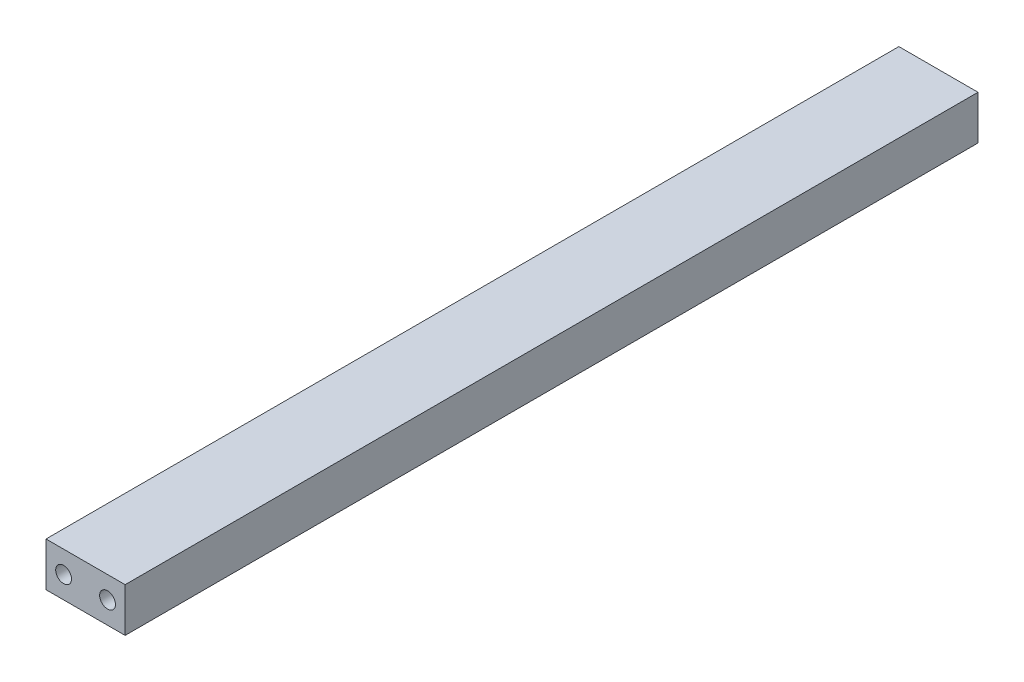
ISO-10303-21;
HEADER;
FILE_DESCRIPTION(('STEP AP214'),'2;1');
FILE_NAME('part.step','',(''),(''),'','','');
FILE_SCHEMA(('AUTOMOTIVE_DESIGN { 1 0 10303 214 1 1 1 1 }'));
ENDSEC;
DATA;
#1=APPLICATION_CONTEXT('core data for automotive mechanical design processes');
#2=APPLICATION_PROTOCOL_DEFINITION('international standard','automotive_design',2000,#1);
#3=PRODUCT_CONTEXT('',#1,'mechanical');
#4=PRODUCT('Part','Part','',(#3));
#5=PRODUCT_RELATED_PRODUCT_CATEGORY('part','',(#4));
#6=PRODUCT_DEFINITION_FORMATION('','',#4);
#7=PRODUCT_DEFINITION_CONTEXT('part definition',#1,'design');
#8=PRODUCT_DEFINITION('design','',#6,#7);
#9=PRODUCT_DEFINITION_SHAPE('','',#8);
#10=(LENGTH_UNIT() NAMED_UNIT(*) SI_UNIT(.MILLI.,.METRE.));
#11=(NAMED_UNIT(*) PLANE_ANGLE_UNIT() SI_UNIT($,.RADIAN.));
#12=(NAMED_UNIT(*) SI_UNIT($,.STERADIAN.) SOLID_ANGLE_UNIT());
#13=UNCERTAINTY_MEASURE_WITH_UNIT(LENGTH_MEASURE(1.E-05),#10,'distance_accuracy_value','');
#14=(GEOMETRIC_REPRESENTATION_CONTEXT(3) GLOBAL_UNCERTAINTY_ASSIGNED_CONTEXT((#13)) GLOBAL_UNIT_ASSIGNED_CONTEXT((#10,
#11,#12)) REPRESENTATION_CONTEXT('',''));
#15=CARTESIAN_POINT('',(0.,0.,0.));
#16=DIRECTION('',(0.,0.,1.));
#17=DIRECTION('',(1.,0.,0.));
#18=AXIS2_PLACEMENT_3D('',#15,#16,#17);
#19=CARTESIAN_POINT('',(0.,12.7,-246.38));
#20=DIRECTION('',(-1.,0.,0.));
#21=DIRECTION('',(0.,-1.,0.));
#22=AXIS2_PLACEMENT_3D('',#19,#20,#21);
#23=PLANE('',#22);
#24=DIRECTION('',(0.,-1.,0.));
#25=VECTOR('',#24,1.);
#26=CARTESIAN_POINT('',(0.,12.7,0.));
#27=LINE('',#26,#25);
#28=CARTESIAN_POINT('',(0.,12.7,0.));
#29=VERTEX_POINT('',#28);
#30=CARTESIAN_POINT('',(0.,0.,0.));
#31=VERTEX_POINT('',#30);
#32=EDGE_CURVE('E112',#29,#31,#27,.T.);
#33=ORIENTED_EDGE('',*,*,#32,.F.);
#34=DIRECTION('',(0.,0.,1.));
#35=VECTOR('',#34,1.);
#36=CARTESIAN_POINT('',(0.,12.7,-246.38));
#37=LINE('',#36,#35);
#38=CARTESIAN_POINT('',(0.,12.7,-246.38));
#39=VERTEX_POINT('',#38);
#40=EDGE_CURVE('E11',#39,#29,#37,.T.);
#41=ORIENTED_EDGE('',*,*,#40,.F.);
#42=DIRECTION('',(0.,-1.,0.));
#43=VECTOR('',#42,1.);
#44=CARTESIAN_POINT('',(0.,12.7,-246.38));
#45=LINE('',#44,#43);
#46=CARTESIAN_POINT('',(0.,0.,-246.38));
#47=VERTEX_POINT('',#46);
#48=EDGE_CURVE('E105',#39,#47,#45,.T.);
#49=ORIENTED_EDGE('',*,*,#48,.T.);
#50=DIRECTION('',(0.,0.,1.));
#51=VECTOR('',#50,1.);
#52=CARTESIAN_POINT('',(0.,0.,-246.38));
#53=LINE('',#52,#51);
#54=EDGE_CURVE('E44',#47,#31,#53,.T.);
#55=ORIENTED_EDGE('',*,*,#54,.T.);
#56=EDGE_LOOP('',(#33,#41,#49,#55));
#57=FACE_BOUND('',#56,.T.);
#58=ADVANCED_FACE('F41',(#57),#23,.T.);
#59=CARTESIAN_POINT('',(0.,12.7,-246.38));
#60=DIRECTION('',(0.,1.,0.));
#61=DIRECTION('',(0.,0.,1.));
#62=AXIS2_PLACEMENT_3D('',#59,#60,#61);
#63=PLANE('',#62);
#64=DIRECTION('',(-1.,0.,0.));
#65=VECTOR('',#64,1.);
#66=CARTESIAN_POINT('',(0.,12.7,0.));
#67=LINE('',#66,#65);
#68=CARTESIAN_POINT('',(22.86,12.7,0.));
#69=VERTEX_POINT('',#68);
#70=EDGE_CURVE('E107',#69,#29,#67,.T.);
#71=ORIENTED_EDGE('',*,*,#70,.F.);
#72=DIRECTION('',(0.,0.,1.));
#73=VECTOR('',#72,1.);
#74=CARTESIAN_POINT('',(22.86,12.7,-246.38));
#75=LINE('',#74,#73);
#76=CARTESIAN_POINT('',(22.86,12.7,-246.38));
#77=VERTEX_POINT('',#76);
#78=EDGE_CURVE('E51',#77,#69,#75,.T.);
#79=ORIENTED_EDGE('',*,*,#78,.F.);
#80=DIRECTION('',(-1.,0.,0.));
#81=VECTOR('',#80,1.);
#82=CARTESIAN_POINT('',(0.,12.7,-246.38));
#83=LINE('',#82,#81);
#84=EDGE_CURVE('E102',#77,#39,#83,.T.);
#85=ORIENTED_EDGE('',*,*,#84,.T.);
#86=ORIENTED_EDGE('',*,*,#40,.T.);
#87=EDGE_LOOP('',(#71,#79,#85,#86));
#88=FACE_BOUND('',#87,.T.);
#89=ADVANCED_FACE('F137',(#88),#63,.T.);
#90=CARTESIAN_POINT('',(22.86,12.7,-246.38));
#91=DIRECTION('',(1.,0.,0.));
#92=DIRECTION('',(0.,0.,-1.));
#93=AXIS2_PLACEMENT_3D('',#90,#91,#92);
#94=PLANE('',#93);
#95=DIRECTION('',(0.,1.,0.));
#96=VECTOR('',#95,1.);
#97=CARTESIAN_POINT('',(22.86,12.7,0.));
#98=LINE('',#97,#96);
#99=CARTESIAN_POINT('',(22.86,0.,0.));
#100=VERTEX_POINT('',#99);
#101=EDGE_CURVE('E96',#100,#69,#98,.T.);
#102=ORIENTED_EDGE('',*,*,#101,.F.);
#103=DIRECTION('',(0.,0.,1.));
#104=VECTOR('',#103,1.);
#105=CARTESIAN_POINT('',(22.86,0.,-246.38));
#106=LINE('',#105,#104);
#107=CARTESIAN_POINT('',(22.86,0.,-246.38));
#108=VERTEX_POINT('',#107);
#109=EDGE_CURVE('E91',#108,#100,#106,.T.);
#110=ORIENTED_EDGE('',*,*,#109,.F.);
#111=DIRECTION('',(0.,1.,0.));
#112=VECTOR('',#111,1.);
#113=CARTESIAN_POINT('',(22.86,12.7,-246.38));
#114=LINE('',#113,#112);
#115=EDGE_CURVE('E94',#108,#77,#114,.T.);
#116=ORIENTED_EDGE('',*,*,#115,.T.);
#117=ORIENTED_EDGE('',*,*,#78,.T.);
#118=EDGE_LOOP('',(#102,#110,#116,#117));
#119=FACE_BOUND('',#118,.T.);
#120=ADVANCED_FACE('F93',(#119),#94,.T.);
#121=CARTESIAN_POINT('',(0.,0.,-246.38));
#122=DIRECTION('',(0.,-1.,0.));
#123=DIRECTION('',(0.,0.,-1.));
#124=AXIS2_PLACEMENT_3D('',#121,#122,#123);
#125=PLANE('',#124);
#126=DIRECTION('',(1.,0.,0.));
#127=VECTOR('',#126,1.);
#128=CARTESIAN_POINT('',(0.,0.,0.));
#129=LINE('',#128,#127);
#130=EDGE_CURVE('E116',#31,#100,#129,.T.);
#131=ORIENTED_EDGE('',*,*,#130,.F.);
#132=ORIENTED_EDGE('',*,*,#54,.F.);
#133=DIRECTION('',(1.,0.,0.));
#134=VECTOR('',#133,1.);
#135=CARTESIAN_POINT('',(0.,0.,-246.38));
#136=LINE('',#135,#134);
#137=EDGE_CURVE('E101',#47,#108,#136,.T.);
#138=ORIENTED_EDGE('',*,*,#137,.T.);
#139=ORIENTED_EDGE('',*,*,#109,.T.);
#140=EDGE_LOOP('',(#131,#132,#138,#139));
#141=FACE_BOUND('',#140,.T.);
#142=ADVANCED_FACE('F104',(#141),#125,.T.);
#143=CARTESIAN_POINT('',(0.,0.,-246.38));
#144=DIRECTION('',(0.,0.,1.));
#145=DIRECTION('',(1.,0.,0.));
#146=AXIS2_PLACEMENT_3D('',#143,#144,#145);
#147=PLANE('',#146);
#148=CARTESIAN_POINT('',(17.78,6.35,-246.38));
#149=DIRECTION('',(0.,0.,1.));
#150=DIRECTION('',(1.,0.,0.));
#151=AXIS2_PLACEMENT_3D('',#148,#149,#150);
#152=CIRCLE('',#151,2.28599999999999);
#153=CARTESIAN_POINT('',(20.066,6.35,-246.38));
#154=VERTEX_POINT('',#153);
#155=EDGE_CURVE('E129',#154,#154,#152,.T.);
#156=ORIENTED_EDGE('',*,*,#155,.T.);
#157=EDGE_LOOP('',(#156));
#158=FACE_BOUND('',#157,.T.);
#159=CARTESIAN_POINT('',(5.08,6.35,-246.38));
#160=DIRECTION('',(0.,0.,1.));
#161=DIRECTION('',(1.,0.,0.));
#162=AXIS2_PLACEMENT_3D('',#159,#160,#161);
#163=CIRCLE('',#162,2.286);
#164=CARTESIAN_POINT('',(7.366,6.35,-246.38));
#165=VERTEX_POINT('',#164);
#166=EDGE_CURVE('E117',#165,#165,#163,.T.);
#167=ORIENTED_EDGE('',*,*,#166,.T.);
#168=EDGE_LOOP('',(#167));
#169=FACE_BOUND('',#168,.T.);
#170=ORIENTED_EDGE('',*,*,#48,.F.);
#171=ORIENTED_EDGE('',*,*,#84,.F.);
#172=ORIENTED_EDGE('',*,*,#115,.F.);
#173=ORIENTED_EDGE('',*,*,#137,.F.);
#174=EDGE_LOOP('',(#170,#171,#172,#173));
#175=FACE_BOUND('',#174,.T.);
#176=ADVANCED_FACE('F100',(#158,#169,#175),#147,.F.);
#177=CARTESIAN_POINT('',(0.,0.,0.));
#178=DIRECTION('',(0.,0.,1.));
#179=DIRECTION('',(1.,0.,0.));
#180=AXIS2_PLACEMENT_3D('',#177,#178,#179);
#181=PLANE('',#180);
#182=CARTESIAN_POINT('',(17.78,6.35,0.));
#183=DIRECTION('',(0.,0.,1.));
#184=DIRECTION('',(1.,0.,0.));
#185=AXIS2_PLACEMENT_3D('',#182,#183,#184);
#186=CIRCLE('',#185,2.28599999999999);
#187=CARTESIAN_POINT('',(20.066,6.35,0.));
#188=VERTEX_POINT('',#187);
#189=EDGE_CURVE('E127',#188,#188,#186,.T.);
#190=ORIENTED_EDGE('',*,*,#189,.F.);
#191=EDGE_LOOP('',(#190));
#192=FACE_BOUND('',#191,.T.);
#193=CARTESIAN_POINT('',(5.08,6.35,0.));
#194=DIRECTION('',(0.,0.,1.));
#195=DIRECTION('',(1.,0.,0.));
#196=AXIS2_PLACEMENT_3D('',#193,#194,#195);
#197=CIRCLE('',#196,2.286);
#198=CARTESIAN_POINT('',(7.366,6.35,0.));
#199=VERTEX_POINT('',#198);
#200=EDGE_CURVE('E132',#199,#199,#197,.T.);
#201=ORIENTED_EDGE('',*,*,#200,.F.);
#202=EDGE_LOOP('',(#201));
#203=FACE_BOUND('',#202,.T.);
#204=ORIENTED_EDGE('',*,*,#32,.T.);
#205=ORIENTED_EDGE('',*,*,#130,.T.);
#206=ORIENTED_EDGE('',*,*,#101,.T.);
#207=ORIENTED_EDGE('',*,*,#70,.T.);
#208=EDGE_LOOP('',(#204,#205,#206,#207));
#209=FACE_BOUND('',#208,.T.);
#210=ADVANCED_FACE('F136',(#192,#203,#209),#181,.T.);
#211=CARTESIAN_POINT('',(5.08,6.35,-246.38));
#212=DIRECTION('',(0.,0.,1.));
#213=DIRECTION('',(1.,0.,0.));
#214=AXIS2_PLACEMENT_3D('',#211,#212,#213);
#215=CYLINDRICAL_SURFACE('',#214,2.286);
#216=CARTESIAN_POINT('',(7.366,6.35,-246.38));
#217=CARTESIAN_POINT('',(7.366,6.35,-243.813541666666));
#218=CARTESIAN_POINT('',(7.366,6.35,-241.247083333333));
#219=CARTESIAN_POINT('',(7.366,6.35,-236.114166666666));
#220=CARTESIAN_POINT('',(7.366,6.35,-233.547708333333));
#221=CARTESIAN_POINT('',(7.366,6.35,-228.414791666666));
#222=CARTESIAN_POINT('',(7.366,6.35,-225.848333333333));
#223=CARTESIAN_POINT('',(7.366,6.35,-220.715416666666));
#224=CARTESIAN_POINT('',(7.366,6.35,-218.148958333333));
#225=CARTESIAN_POINT('',(7.366,6.35,-213.016041666666));
#226=CARTESIAN_POINT('',(7.366,6.35,-210.449583333333));
#227=CARTESIAN_POINT('',(7.366,6.35,-205.316666666667));
#228=CARTESIAN_POINT('',(7.366,6.35,-202.750208333333));
#229=CARTESIAN_POINT('',(7.366,6.35,-197.617291666666));
#230=CARTESIAN_POINT('',(7.366,6.35,-195.050833333333));
#231=CARTESIAN_POINT('',(7.366,6.35,-189.917916666666));
#232=CARTESIAN_POINT('',(7.366,6.35,-187.351458333333));
#233=CARTESIAN_POINT('',(7.366,6.35,-182.218541666667));
#234=CARTESIAN_POINT('',(7.366,6.35,-179.652083333333));
#235=CARTESIAN_POINT('',(7.366,6.35,-174.519166666667));
#236=CARTESIAN_POINT('',(7.366,6.35,-171.952708333333));
#237=CARTESIAN_POINT('',(7.366,6.35,-166.819791666667));
#238=CARTESIAN_POINT('',(7.366,6.35,-164.253333333333));
#239=CARTESIAN_POINT('',(7.366,6.35,-159.120416666667));
#240=CARTESIAN_POINT('',(7.366,6.35,-156.553958333333));
#241=CARTESIAN_POINT('',(7.366,6.35,-151.421041666667));
#242=CARTESIAN_POINT('',(7.366,6.35,-148.854583333333));
#243=CARTESIAN_POINT('',(7.366,6.35,-143.721666666667));
#244=CARTESIAN_POINT('',(7.366,6.35,-141.155208333333));
#245=CARTESIAN_POINT('',(7.366,6.35,-136.022291666667));
#246=CARTESIAN_POINT('',(7.366,6.35,-133.455833333333));
#247=CARTESIAN_POINT('',(7.366,6.35,-128.322916666667));
#248=CARTESIAN_POINT('',(7.366,6.35,-125.756458333333));
#249=CARTESIAN_POINT('',(7.366,6.35,-120.623541666667));
#250=CARTESIAN_POINT('',(7.366,6.35,-118.057083333333));
#251=CARTESIAN_POINT('',(7.366,6.35,-112.924166666667));
#252=CARTESIAN_POINT('',(7.366,6.35,-110.357708333333));
#253=CARTESIAN_POINT('',(7.366,6.35,-105.224791666667));
#254=CARTESIAN_POINT('',(7.366,6.35,-102.658333333333));
#255=CARTESIAN_POINT('',(7.366,6.35,-97.5254166666666));
#256=CARTESIAN_POINT('',(7.366,6.35,-94.9589583333333));
#257=CARTESIAN_POINT('',(7.366,6.35,-89.8260416666666));
#258=CARTESIAN_POINT('',(7.366,6.35,-87.2595833333333));
#259=CARTESIAN_POINT('',(7.366,6.35,-82.1266666666666));
#260=CARTESIAN_POINT('',(7.366,6.35,-79.5602083333333));
#261=CARTESIAN_POINT('',(7.366,6.35,-74.4272916666666));
#262=CARTESIAN_POINT('',(7.366,6.35,-71.8608333333333));
#263=CARTESIAN_POINT('',(7.366,6.35,-66.7279166666666));
#264=CARTESIAN_POINT('',(7.366,6.35,-64.1614583333333));
#265=CARTESIAN_POINT('',(7.366,6.35,-59.0285416666666));
#266=CARTESIAN_POINT('',(7.366,6.35,-56.4620833333333));
#267=CARTESIAN_POINT('',(7.366,6.35,-51.3291666666667));
#268=CARTESIAN_POINT('',(7.366,6.35,-48.7627083333333));
#269=CARTESIAN_POINT('',(7.366,6.35,-43.6297916666667));
#270=CARTESIAN_POINT('',(7.366,6.35,-41.0633333333333));
#271=CARTESIAN_POINT('',(7.366,6.35,-35.9304166666667));
#272=CARTESIAN_POINT('',(7.366,6.35,-33.3639583333333));
#273=CARTESIAN_POINT('',(7.366,6.35,-28.2310416666667));
#274=CARTESIAN_POINT('',(7.366,6.35,-25.6645833333333));
#275=CARTESIAN_POINT('',(7.366,6.35,-20.5316666666667));
#276=CARTESIAN_POINT('',(7.366,6.35,-17.9652083333333));
#277=CARTESIAN_POINT('',(7.366,6.35,-12.8322916666667));
#278=CARTESIAN_POINT('',(7.366,6.35,-10.2658333333333));
#279=CARTESIAN_POINT('',(7.366,6.35,-5.13291666666668));
#280=CARTESIAN_POINT('',(7.366,6.35,-2.56645833333335));
#281=CARTESIAN_POINT('',(7.366,6.35,0.));
#282=B_SPLINE_CURVE_WITH_KNOTS('',3,(#216,#217,#218,#219,#220,#221,#222,#223,#224,#225,#226,
#227,#228,#229,#230,#231,#232,#233,#234,#235,#236,#237,#238,#239,#240,#241,#242,#243,#244,#245,
#246,#247,#248,#249,#250,#251,#252,#253,#254,#255,#256,#257,#258,#259,#260,#261,#262,#263,#264,
#265,#266,#267,#268,#269,#270,#271,#272,#273,#274,#275,#276,#277,#278,#279,#280,#281),
.UNSPECIFIED.,.F.,.F.,(4,2,2,2,2,2,2,2,2,2,2,2,2,2,2,2,2,2,2,2,2,2,2,2,2,2,2,2,2,2,2,2,4),(0.,
7.69937500000001,15.39875,23.098125,30.7975,38.496875,46.19625,53.895625,61.595,
69.2943749999999,76.9937499999999,84.6931249999999,92.3924999999999,100.091875,107.79125,
115.490625,123.19,130.889375,138.58875,146.288125,153.9875,161.686875,169.38625,177.085625,
184.785,192.484375,200.18375,207.883125,215.5825,223.281875,230.98125,238.680625,246.38),.UNSPECIFIED.);
#283=EDGE_CURVE('BSEAM155',#165,#199,#282,.T.);
#284=ORIENTED_EDGE('',*,*,#166,.F.);
#285=ORIENTED_EDGE('',*,*,#200,.T.);
#286=ORIENTED_EDGE('',*,*,#283,.T.);
#287=ORIENTED_EDGE('',*,*,#283,.F.);
#288=EDGE_LOOP('',(#284,#286,#285,#287));
#289=FACE_BOUND('',#288,.T.);
#290=ADVANCED_FACE('F155',(#289),#215,.F.);
#291=CARTESIAN_POINT('',(17.78,6.35,-246.38));
#292=DIRECTION('',(0.,0.,1.));
#293=DIRECTION('',(1.,0.,0.));
#294=AXIS2_PLACEMENT_3D('',#291,#292,#293);
#295=CYLINDRICAL_SURFACE('',#294,2.28599999999999);
#296=CARTESIAN_POINT('',(20.066,6.35,-246.38));
#297=CARTESIAN_POINT('',(20.066,6.35,-243.813541666666));
#298=CARTESIAN_POINT('',(20.066,6.35,-241.247083333333));
#299=CARTESIAN_POINT('',(20.066,6.35,-236.114166666666));
#300=CARTESIAN_POINT('',(20.066,6.35,-233.547708333333));
#301=CARTESIAN_POINT('',(20.066,6.35,-228.414791666666));
#302=CARTESIAN_POINT('',(20.066,6.35,-225.848333333333));
#303=CARTESIAN_POINT('',(20.066,6.35,-220.715416666666));
#304=CARTESIAN_POINT('',(20.066,6.35,-218.148958333333));
#305=CARTESIAN_POINT('',(20.066,6.35,-213.016041666666));
#306=CARTESIAN_POINT('',(20.066,6.35,-210.449583333333));
#307=CARTESIAN_POINT('',(20.066,6.35,-205.316666666667));
#308=CARTESIAN_POINT('',(20.066,6.35,-202.750208333333));
#309=CARTESIAN_POINT('',(20.066,6.35,-197.617291666666));
#310=CARTESIAN_POINT('',(20.066,6.35,-195.050833333333));
#311=CARTESIAN_POINT('',(20.066,6.35,-189.917916666666));
#312=CARTESIAN_POINT('',(20.066,6.35,-187.351458333333));
#313=CARTESIAN_POINT('',(20.066,6.35,-182.218541666667));
#314=CARTESIAN_POINT('',(20.066,6.35,-179.652083333333));
#315=CARTESIAN_POINT('',(20.066,6.35,-174.519166666667));
#316=CARTESIAN_POINT('',(20.066,6.35,-171.952708333333));
#317=CARTESIAN_POINT('',(20.066,6.35,-166.819791666667));
#318=CARTESIAN_POINT('',(20.066,6.35,-164.253333333333));
#319=CARTESIAN_POINT('',(20.066,6.35,-159.120416666667));
#320=CARTESIAN_POINT('',(20.066,6.35,-156.553958333333));
#321=CARTESIAN_POINT('',(20.066,6.35,-151.421041666667));
#322=CARTESIAN_POINT('',(20.066,6.35,-148.854583333333));
#323=CARTESIAN_POINT('',(20.066,6.35,-143.721666666667));
#324=CARTESIAN_POINT('',(20.066,6.35,-141.155208333333));
#325=CARTESIAN_POINT('',(20.066,6.35,-136.022291666667));
#326=CARTESIAN_POINT('',(20.066,6.35,-133.455833333333));
#327=CARTESIAN_POINT('',(20.066,6.35,-128.322916666667));
#328=CARTESIAN_POINT('',(20.066,6.35,-125.756458333333));
#329=CARTESIAN_POINT('',(20.066,6.35,-120.623541666667));
#330=CARTESIAN_POINT('',(20.066,6.35,-118.057083333333));
#331=CARTESIAN_POINT('',(20.066,6.35,-112.924166666667));
#332=CARTESIAN_POINT('',(20.066,6.35,-110.357708333333));
#333=CARTESIAN_POINT('',(20.066,6.35,-105.224791666667));
#334=CARTESIAN_POINT('',(20.066,6.35,-102.658333333333));
#335=CARTESIAN_POINT('',(20.066,6.35,-97.5254166666666));
#336=CARTESIAN_POINT('',(20.066,6.35,-94.9589583333333));
#337=CARTESIAN_POINT('',(20.066,6.35,-89.8260416666666));
#338=CARTESIAN_POINT('',(20.066,6.35,-87.2595833333333));
#339=CARTESIAN_POINT('',(20.066,6.35,-82.1266666666666));
#340=CARTESIAN_POINT('',(20.066,6.35,-79.5602083333333));
#341=CARTESIAN_POINT('',(20.066,6.35,-74.4272916666666));
#342=CARTESIAN_POINT('',(20.066,6.35,-71.8608333333333));
#343=CARTESIAN_POINT('',(20.066,6.35,-66.7279166666666));
#344=CARTESIAN_POINT('',(20.066,6.35,-64.1614583333333));
#345=CARTESIAN_POINT('',(20.066,6.35,-59.0285416666666));
#346=CARTESIAN_POINT('',(20.066,6.35,-56.4620833333333));
#347=CARTESIAN_POINT('',(20.066,6.35,-51.3291666666667));
#348=CARTESIAN_POINT('',(20.066,6.35,-48.7627083333333));
#349=CARTESIAN_POINT('',(20.066,6.35,-43.6297916666667));
#350=CARTESIAN_POINT('',(20.066,6.35,-41.0633333333333));
#351=CARTESIAN_POINT('',(20.066,6.35,-35.9304166666667));
#352=CARTESIAN_POINT('',(20.066,6.35,-33.3639583333333));
#353=CARTESIAN_POINT('',(20.066,6.35,-28.2310416666667));
#354=CARTESIAN_POINT('',(20.066,6.35,-25.6645833333333));
#355=CARTESIAN_POINT('',(20.066,6.35,-20.5316666666667));
#356=CARTESIAN_POINT('',(20.066,6.35,-17.9652083333333));
#357=CARTESIAN_POINT('',(20.066,6.35,-12.8322916666667));
#358=CARTESIAN_POINT('',(20.066,6.35,-10.2658333333333));
#359=CARTESIAN_POINT('',(20.066,6.35,-5.13291666666668));
#360=CARTESIAN_POINT('',(20.066,6.35,-2.56645833333335));
#361=CARTESIAN_POINT('',(20.066,6.35,0.));
#362=B_SPLINE_CURVE_WITH_KNOTS('',3,(#296,#297,#298,#299,#300,#301,#302,#303,#304,#305,#306,
#307,#308,#309,#310,#311,#312,#313,#314,#315,#316,#317,#318,#319,#320,#321,#322,#323,#324,#325,
#326,#327,#328,#329,#330,#331,#332,#333,#334,#335,#336,#337,#338,#339,#340,#341,#342,#343,#344,
#345,#346,#347,#348,#349,#350,#351,#352,#353,#354,#355,#356,#357,#358,#359,#360,#361),
.UNSPECIFIED.,.F.,.F.,(4,2,2,2,2,2,2,2,2,2,2,2,2,2,2,2,2,2,2,2,2,2,2,2,2,2,2,2,2,2,2,2,4),(0.,
7.69937500000001,15.39875,23.098125,30.7975,38.496875,46.19625,53.895625,61.595,
69.2943749999999,76.9937499999999,84.6931249999999,92.3924999999999,100.091875,107.79125,
115.490625,123.19,130.889375,138.58875,146.288125,153.9875,161.686875,169.38625,177.085625,
184.785,192.484375,200.18375,207.883125,215.5825,223.281875,230.98125,238.680625,246.38),.UNSPECIFIED.);
#363=EDGE_CURVE('BSEAM162',#154,#188,#362,.T.);
#364=ORIENTED_EDGE('',*,*,#155,.F.);
#365=ORIENTED_EDGE('',*,*,#189,.T.);
#366=ORIENTED_EDGE('',*,*,#363,.T.);
#367=ORIENTED_EDGE('',*,*,#363,.F.);
#368=EDGE_LOOP('',(#364,#366,#365,#367));
#369=FACE_BOUND('',#368,.T.);
#370=ADVANCED_FACE('F162',(#369),#295,.F.);
#371=CLOSED_SHELL('',(#58,#89,#120,#142,#176,#210,#290,#370));
#372=MANIFOLD_SOLID_BREP('B2',#371);
#373=ADVANCED_BREP_SHAPE_REPRESENTATION('',(#18,#372),#14);
#374=SHAPE_DEFINITION_REPRESENTATION(#9,#373);
ENDSEC;
END-ISO-10303-21;
